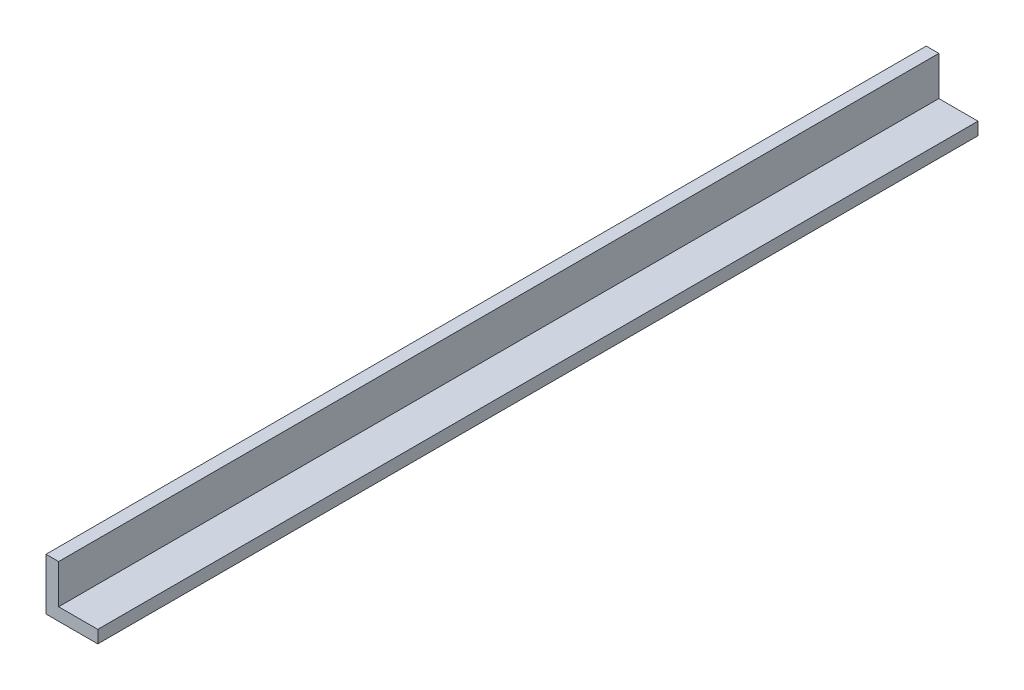
ISO-10303-21;
HEADER;
FILE_DESCRIPTION(('STEP AP214'),'2;1');
FILE_NAME('part.step','',(''),(''),'','','');
FILE_SCHEMA(('AUTOMOTIVE_DESIGN { 1 0 10303 214 1 1 1 1 }'));
ENDSEC;
DATA;
#1=APPLICATION_CONTEXT('core data for automotive mechanical design processes');
#2=APPLICATION_PROTOCOL_DEFINITION('international standard','automotive_design',2000,#1);
#3=PRODUCT_CONTEXT('',#1,'mechanical');
#4=PRODUCT('Part','Part','',(#3));
#5=PRODUCT_RELATED_PRODUCT_CATEGORY('part','',(#4));
#6=PRODUCT_DEFINITION_FORMATION('','',#4);
#7=PRODUCT_DEFINITION_CONTEXT('part definition',#1,'design');
#8=PRODUCT_DEFINITION('design','',#6,#7);
#9=PRODUCT_DEFINITION_SHAPE('','',#8);
#10=(LENGTH_UNIT() NAMED_UNIT(*) SI_UNIT(.MILLI.,.METRE.));
#11=(NAMED_UNIT(*) PLANE_ANGLE_UNIT() SI_UNIT($,.RADIAN.));
#12=(NAMED_UNIT(*) SI_UNIT($,.STERADIAN.) SOLID_ANGLE_UNIT());
#13=UNCERTAINTY_MEASURE_WITH_UNIT(LENGTH_MEASURE(1.E-05),#10,'distance_accuracy_value','');
#14=(GEOMETRIC_REPRESENTATION_CONTEXT(3) GLOBAL_UNCERTAINTY_ASSIGNED_CONTEXT((#13)) GLOBAL_UNIT_ASSIGNED_CONTEXT((#10,
#11,#12)) REPRESENTATION_CONTEXT('',''));
#15=CARTESIAN_POINT('',(0.,0.,0.));
#16=DIRECTION('',(0.,0.,1.));
#17=DIRECTION('',(1.,0.,0.));
#18=AXIS2_PLACEMENT_3D('',#15,#16,#17);
#19=CARTESIAN_POINT('',(0.,12.7,215.9));
#20=DIRECTION('',(1.,0.,0.));
#21=DIRECTION('',(0.,1.,0.));
#22=AXIS2_PLACEMENT_3D('',#19,#20,#21);
#23=PLANE('',#22);
#24=DIRECTION('',(0.,-1.,0.));
#25=VECTOR('',#24,1.);
#26=CARTESIAN_POINT('',(0.,12.7,0.));
#27=LINE('',#26,#25);
#28=CARTESIAN_POINT('',(0.,12.7,0.));
#29=VERTEX_POINT('',#28);
#30=CARTESIAN_POINT('',(0.,0.,0.));
#31=VERTEX_POINT('',#30);
#32=EDGE_CURVE('E117',#29,#31,#27,.T.);
#33=ORIENTED_EDGE('',*,*,#32,.T.);
#34=DIRECTION('',(0.,0.,-1.));
#35=VECTOR('',#34,1.);
#36=CARTESIAN_POINT('',(0.,0.,215.9));
#37=LINE('',#36,#35);
#38=CARTESIAN_POINT('',(0.,0.,215.9));
#39=VERTEX_POINT('',#38);
#40=EDGE_CURVE('E11',#39,#31,#37,.T.);
#41=ORIENTED_EDGE('',*,*,#40,.F.);
#42=DIRECTION('',(0.,-1.,0.));
#43=VECTOR('',#42,1.);
#44=CARTESIAN_POINT('',(0.,12.7,215.9));
#45=LINE('',#44,#43);
#46=CARTESIAN_POINT('',(0.,12.7,215.9));
#47=VERTEX_POINT('',#46);
#48=EDGE_CURVE('E127',#47,#39,#45,.T.);
#49=ORIENTED_EDGE('',*,*,#48,.F.);
#50=DIRECTION('',(0.,0.,-1.));
#51=VECTOR('',#50,1.);
#52=CARTESIAN_POINT('',(0.,12.7,215.9));
#53=LINE('',#52,#51);
#54=EDGE_CURVE('E113',#47,#29,#53,.T.);
#55=ORIENTED_EDGE('',*,*,#54,.T.);
#56=EDGE_LOOP('',(#33,#41,#49,#55));
#57=FACE_BOUND('',#56,.T.);
#58=ADVANCED_FACE('F33',(#57),#23,.F.);
#59=CARTESIAN_POINT('',(0.,0.,215.9));
#60=DIRECTION('',(0.,1.,0.));
#61=DIRECTION('',(0.,0.,1.));
#62=AXIS2_PLACEMENT_3D('',#59,#60,#61);
#63=PLANE('',#62);
#64=DIRECTION('',(1.,0.,0.));
#65=VECTOR('',#64,1.);
#66=CARTESIAN_POINT('',(0.,0.,0.));
#67=LINE('',#66,#65);
#68=CARTESIAN_POINT('',(12.7,0.,0.));
#69=VERTEX_POINT('',#68);
#70=EDGE_CURVE('E120',#31,#69,#67,.T.);
#71=ORIENTED_EDGE('',*,*,#70,.T.);
#72=DIRECTION('',(0.,0.,-1.));
#73=VECTOR('',#72,1.);
#74=CARTESIAN_POINT('',(12.7,0.,215.9));
#75=LINE('',#74,#73);
#76=CARTESIAN_POINT('',(12.7,0.,215.9));
#77=VERTEX_POINT('',#76);
#78=EDGE_CURVE('E41',#77,#69,#75,.T.);
#79=ORIENTED_EDGE('',*,*,#78,.F.);
#80=DIRECTION('',(1.,0.,0.));
#81=VECTOR('',#80,1.);
#82=CARTESIAN_POINT('',(0.,0.,215.9));
#83=LINE('',#82,#81);
#84=EDGE_CURVE('E86',#39,#77,#83,.T.);
#85=ORIENTED_EDGE('',*,*,#84,.F.);
#86=ORIENTED_EDGE('',*,*,#40,.T.);
#87=EDGE_LOOP('',(#71,#79,#85,#86));
#88=FACE_BOUND('',#87,.T.);
#89=ADVANCED_FACE('F151',(#88),#63,.F.);
#90=CARTESIAN_POINT('',(12.7,0.,215.9));
#91=DIRECTION('',(-1.,0.,0.));
#92=DIRECTION('',(0.,0.,1.));
#93=AXIS2_PLACEMENT_3D('',#90,#91,#92);
#94=PLANE('',#93);
#95=DIRECTION('',(0.,1.,0.));
#96=VECTOR('',#95,1.);
#97=CARTESIAN_POINT('',(12.7,0.,0.));
#98=LINE('',#97,#96);
#99=CARTESIAN_POINT('',(12.7,3.0988,0.));
#100=VERTEX_POINT('',#99);
#101=EDGE_CURVE('E122',#69,#100,#98,.T.);
#102=ORIENTED_EDGE('',*,*,#101,.T.);
#103=DIRECTION('',(0.,0.,-1.));
#104=VECTOR('',#103,1.);
#105=CARTESIAN_POINT('',(12.7,3.0988,215.9));
#106=LINE('',#105,#104);
#107=CARTESIAN_POINT('',(12.7,3.0988,215.9));
#108=VERTEX_POINT('',#107);
#109=EDGE_CURVE('E108',#108,#100,#106,.T.);
#110=ORIENTED_EDGE('',*,*,#109,.F.);
#111=DIRECTION('',(0.,1.,0.));
#112=VECTOR('',#111,1.);
#113=CARTESIAN_POINT('',(12.7,0.,215.9));
#114=LINE('',#113,#112);
#115=EDGE_CURVE('E99',#77,#108,#114,.T.);
#116=ORIENTED_EDGE('',*,*,#115,.F.);
#117=ORIENTED_EDGE('',*,*,#78,.T.);
#118=EDGE_LOOP('',(#102,#110,#116,#117));
#119=FACE_BOUND('',#118,.T.);
#120=ADVANCED_FACE('F133',(#119),#94,.F.);
#121=CARTESIAN_POINT('',(12.7,3.0988,215.9));
#122=DIRECTION('',(0.,-1.,0.));
#123=DIRECTION('',(1.,0.,0.));
#124=AXIS2_PLACEMENT_3D('',#121,#122,#123);
#125=PLANE('',#124);
#126=DIRECTION('',(-1.,0.,0.));
#127=VECTOR('',#126,1.);
#128=CARTESIAN_POINT('',(12.7,3.0988,0.));
#129=LINE('',#128,#127);
#130=CARTESIAN_POINT('',(3.0988,3.0988,0.));
#131=VERTEX_POINT('',#130);
#132=EDGE_CURVE('E107',#100,#131,#129,.T.);
#133=ORIENTED_EDGE('',*,*,#132,.T.);
#134=DIRECTION('',(0.,0.,-1.));
#135=VECTOR('',#134,1.);
#136=CARTESIAN_POINT('',(3.0988,3.0988,215.9));
#137=LINE('',#136,#135);
#138=CARTESIAN_POINT('',(3.0988,3.0988,215.9));
#139=VERTEX_POINT('',#138);
#140=EDGE_CURVE('E104',#139,#131,#137,.T.);
#141=ORIENTED_EDGE('',*,*,#140,.F.);
#142=DIRECTION('',(-1.,0.,0.));
#143=VECTOR('',#142,1.);
#144=CARTESIAN_POINT('',(12.7,3.0988,215.9));
#145=LINE('',#144,#143);
#146=EDGE_CURVE('E93',#108,#139,#145,.T.);
#147=ORIENTED_EDGE('',*,*,#146,.F.);
#148=ORIENTED_EDGE('',*,*,#109,.T.);
#149=EDGE_LOOP('',(#133,#141,#147,#148));
#150=FACE_BOUND('',#149,.T.);
#151=ADVANCED_FACE('F105',(#150),#125,.F.);
#152=CARTESIAN_POINT('',(3.0988,3.0988,215.9));
#153=DIRECTION('',(-1.,0.,0.));
#154=DIRECTION('',(0.,-1.,0.));
#155=AXIS2_PLACEMENT_3D('',#152,#153,#154);
#156=PLANE('',#155);
#157=DIRECTION('',(0.,1.,0.));
#158=VECTOR('',#157,1.);
#159=CARTESIAN_POINT('',(3.0988,3.0988,0.));
#160=LINE('',#159,#158);
#161=CARTESIAN_POINT('',(3.0988,12.7,0.));
#162=VERTEX_POINT('',#161);
#163=EDGE_CURVE('E72',#131,#162,#160,.T.);
#164=ORIENTED_EDGE('',*,*,#163,.T.);
#165=DIRECTION('',(0.,0.,-1.));
#166=VECTOR('',#165,1.);
#167=CARTESIAN_POINT('',(3.0988,12.7,215.9));
#168=LINE('',#167,#166);
#169=CARTESIAN_POINT('',(3.0988,12.7,215.9));
#170=VERTEX_POINT('',#169);
#171=EDGE_CURVE('E109',#170,#162,#168,.T.);
#172=ORIENTED_EDGE('',*,*,#171,.F.);
#173=DIRECTION('',(0.,1.,0.));
#174=VECTOR('',#173,1.);
#175=CARTESIAN_POINT('',(3.0988,3.0988,215.9));
#176=LINE('',#175,#174);
#177=EDGE_CURVE('E97',#139,#170,#176,.T.);
#178=ORIENTED_EDGE('',*,*,#177,.F.);
#179=ORIENTED_EDGE('',*,*,#140,.T.);
#180=EDGE_LOOP('',(#164,#172,#178,#179));
#181=FACE_BOUND('',#180,.T.);
#182=ADVANCED_FACE('F111',(#181),#156,.F.);
#183=CARTESIAN_POINT('',(3.0988,12.7,215.9));
#184=DIRECTION('',(0.,-1.,0.));
#185=DIRECTION('',(0.,0.,-1.));
#186=AXIS2_PLACEMENT_3D('',#183,#184,#185);
#187=PLANE('',#186);
#188=DIRECTION('',(-1.,0.,0.));
#189=VECTOR('',#188,1.);
#190=CARTESIAN_POINT('',(3.0988,12.7,0.));
#191=LINE('',#190,#189);
#192=EDGE_CURVE('E78',#162,#29,#191,.T.);
#193=ORIENTED_EDGE('',*,*,#192,.T.);
#194=ORIENTED_EDGE('',*,*,#54,.F.);
#195=DIRECTION('',(-1.,0.,0.));
#196=VECTOR('',#195,1.);
#197=CARTESIAN_POINT('',(3.0988,12.7,215.9));
#198=LINE('',#197,#196);
#199=EDGE_CURVE('E49',#170,#47,#198,.T.);
#200=ORIENTED_EDGE('',*,*,#199,.F.);
#201=ORIENTED_EDGE('',*,*,#171,.T.);
#202=EDGE_LOOP('',(#193,#194,#200,#201));
#203=FACE_BOUND('',#202,.T.);
#204=ADVANCED_FACE('F140',(#203),#187,.F.);
#205=CARTESIAN_POINT('',(0.,0.,215.9));
#206=DIRECTION('',(0.,0.,1.));
#207=DIRECTION('',(1.,0.,0.));
#208=AXIS2_PLACEMENT_3D('',#205,#206,#207);
#209=PLANE('',#208);
#210=ORIENTED_EDGE('',*,*,#48,.T.);
#211=ORIENTED_EDGE('',*,*,#84,.T.);
#212=ORIENTED_EDGE('',*,*,#115,.T.);
#213=ORIENTED_EDGE('',*,*,#146,.T.);
#214=ORIENTED_EDGE('',*,*,#177,.T.);
#215=ORIENTED_EDGE('',*,*,#199,.T.);
#216=EDGE_LOOP('',(#210,#211,#212,#213,#214,#215));
#217=FACE_BOUND('',#216,.T.);
#218=ADVANCED_FACE('F95',(#217),#209,.T.);
#219=CARTESIAN_POINT('',(0.,0.,0.));
#220=DIRECTION('',(0.,0.,1.));
#221=DIRECTION('',(1.,0.,0.));
#222=AXIS2_PLACEMENT_3D('',#219,#220,#221);
#223=PLANE('',#222);
#224=ORIENTED_EDGE('',*,*,#32,.F.);
#225=ORIENTED_EDGE('',*,*,#192,.F.);
#226=ORIENTED_EDGE('',*,*,#163,.F.);
#227=ORIENTED_EDGE('',*,*,#132,.F.);
#228=ORIENTED_EDGE('',*,*,#101,.F.);
#229=ORIENTED_EDGE('',*,*,#70,.F.);
#230=EDGE_LOOP('',(#224,#225,#226,#227,#228,#229));
#231=FACE_BOUND('',#230,.T.);
#232=ADVANCED_FACE('F136',(#231),#223,.F.);
#233=CLOSED_SHELL('',(#58,#89,#120,#151,#182,#204,#218,#232));
#234=MANIFOLD_SOLID_BREP('B2',#233);
#235=ADVANCED_BREP_SHAPE_REPRESENTATION('',(#18,#234),#14);
#236=SHAPE_DEFINITION_REPRESENTATION(#9,#235);
ENDSEC;
END-ISO-10303-21;
